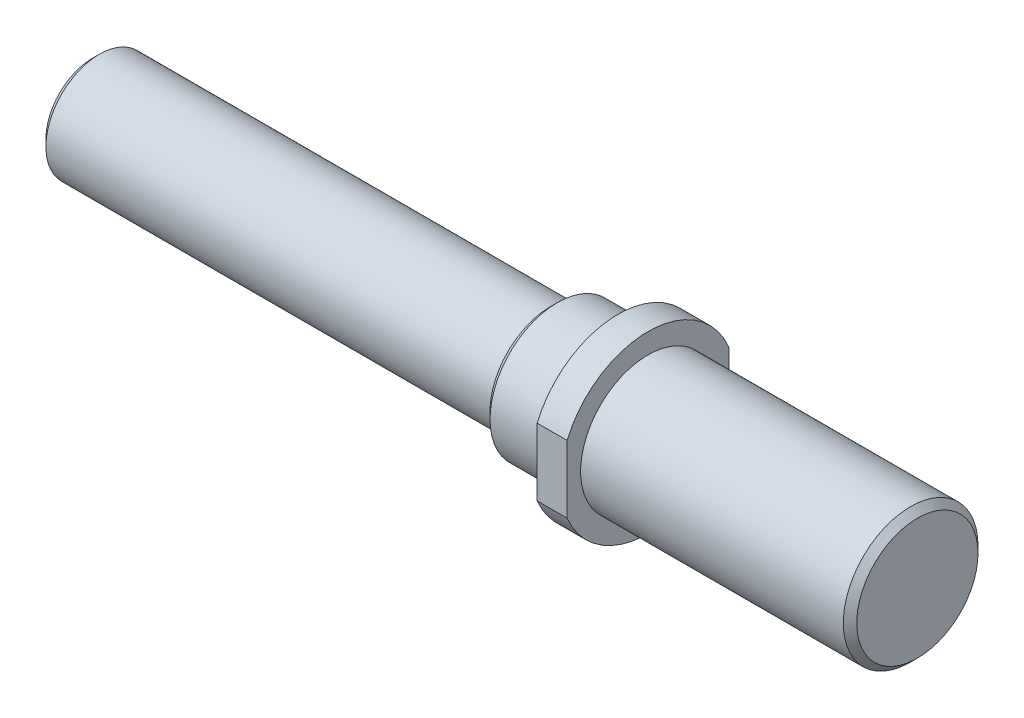
ISO-10303-21;
HEADER;
FILE_DESCRIPTION(('STEP AP214'),'2;1');
FILE_NAME('part.step','',(''),(''),'','','');
FILE_SCHEMA(('AUTOMOTIVE_DESIGN { 1 0 10303 214 1 1 1 1 }'));
ENDSEC;
DATA;
#1=APPLICATION_CONTEXT('core data for automotive mechanical design processes');
#2=APPLICATION_PROTOCOL_DEFINITION('international standard','automotive_design',2000,#1);
#3=PRODUCT_CONTEXT('',#1,'mechanical');
#4=PRODUCT('Part','Part','',(#3));
#5=PRODUCT_RELATED_PRODUCT_CATEGORY('part','',(#4));
#6=PRODUCT_DEFINITION_FORMATION('','',#4);
#7=PRODUCT_DEFINITION_CONTEXT('part definition',#1,'design');
#8=PRODUCT_DEFINITION('design','',#6,#7);
#9=PRODUCT_DEFINITION_SHAPE('','',#8);
#10=(LENGTH_UNIT() NAMED_UNIT(*) SI_UNIT(.MILLI.,.METRE.));
#11=(NAMED_UNIT(*) PLANE_ANGLE_UNIT() SI_UNIT($,.RADIAN.));
#12=(NAMED_UNIT(*) SI_UNIT($,.STERADIAN.) SOLID_ANGLE_UNIT());
#13=UNCERTAINTY_MEASURE_WITH_UNIT(LENGTH_MEASURE(1.E-05),#10,'distance_accuracy_value','');
#14=(GEOMETRIC_REPRESENTATION_CONTEXT(3) GLOBAL_UNCERTAINTY_ASSIGNED_CONTEXT((#13)) GLOBAL_UNIT_ASSIGNED_CONTEXT((#10,
#11,#12)) REPRESENTATION_CONTEXT('',''));
#15=CARTESIAN_POINT('',(0.,0.,0.));
#16=DIRECTION('',(0.,0.,1.));
#17=DIRECTION('',(1.,0.,0.));
#18=AXIS2_PLACEMENT_3D('',#15,#16,#17);
#19=CARTESIAN_POINT('',(20.,0.,0.));
#20=DIRECTION('',(-1.,0.,0.));
#21=DIRECTION('',(0.,0.,1.));
#22=AXIS2_PLACEMENT_3D('',#19,#20,#21);
#23=CYLINDRICAL_SURFACE('',#22,6.5);
#24=DIRECTION('',(1.,0.,0.));
#25=VECTOR('',#24,1.);
#26=CARTESIAN_POINT('',(-41.225,2.50000000000001,-6.));
#27=LINE('',#26,#25);
#28=CARTESIAN_POINT('',(-2.22500000000001,2.50000000000001,-6.));
#29=VERTEX_POINT('',#28);
#30=CARTESIAN_POINT('',(0.,2.50000000000001,-6.));
#31=VERTEX_POINT('',#30);
#32=EDGE_CURVE('E49',#29,#31,#27,.T.);
#33=ORIENTED_EDGE('',*,*,#32,.F.);
#34=CARTESIAN_POINT('',(-2.225,0.,0.));
#35=DIRECTION('',(-1.,0.,0.));
#36=DIRECTION('',(0.,0.,1.));
#37=AXIS2_PLACEMENT_3D('',#34,#35,#36);
#38=CIRCLE('',#37,6.5);
#39=CARTESIAN_POINT('',(-2.22500000000001,2.5,6.));
#40=VERTEX_POINT('',#39);
#41=EDGE_CURVE('E96',#40,#29,#38,.T.);
#42=ORIENTED_EDGE('',*,*,#41,.F.);
#43=DIRECTION('',(1.,0.,0.));
#44=VECTOR('',#43,1.);
#45=CARTESIAN_POINT('',(-41.225,2.5,6.));
#46=LINE('',#45,#44);
#47=CARTESIAN_POINT('',(0.,2.5,6.));
#48=VERTEX_POINT('',#47);
#49=EDGE_CURVE('E183',#40,#48,#46,.T.);
#50=ORIENTED_EDGE('',*,*,#49,.T.);
#51=CARTESIAN_POINT('',(0.,0.,0.));
#52=DIRECTION('',(1.,0.,0.));
#53=DIRECTION('',(0.,0.,-1.));
#54=AXIS2_PLACEMENT_3D('',#51,#52,#53);
#55=CIRCLE('',#54,6.5);
#56=EDGE_CURVE('E94',#31,#48,#55,.T.);
#57=ORIENTED_EDGE('',*,*,#56,.F.);
#58=EDGE_LOOP('',(#33,#42,#50,#57));
#59=FACE_BOUND('',#58,.T.);
#60=ADVANCED_FACE('F34',(#59),#23,.T.);
#61=DIRECTION('',(1.,0.,0.));
#62=VECTOR('',#61,1.);
#63=CARTESIAN_POINT('',(-41.225,-2.50000000000001,-6.));
#64=LINE('',#63,#62);
#65=CARTESIAN_POINT('',(-2.22500000000001,-2.50000000000001,-6.));
#66=VERTEX_POINT('',#65);
#67=CARTESIAN_POINT('',(0.,-2.50000000000001,-6.));
#68=VERTEX_POINT('',#67);
#69=EDGE_CURVE('E77',#66,#68,#64,.T.);
#70=ORIENTED_EDGE('',*,*,#69,.T.);
#71=CARTESIAN_POINT('',(0.,-2.5,6.));
#72=VERTEX_POINT('',#71);
#73=EDGE_CURVE('E87',#72,#68,#55,.T.);
#74=ORIENTED_EDGE('',*,*,#73,.F.);
#75=DIRECTION('',(1.,0.,0.));
#76=VECTOR('',#75,1.);
#77=CARTESIAN_POINT('',(-41.225,-2.5,6.));
#78=LINE('',#77,#76);
#79=CARTESIAN_POINT('',(-2.22500000000001,-2.5,6.));
#80=VERTEX_POINT('',#79);
#81=EDGE_CURVE('E57',#80,#72,#78,.T.);
#82=ORIENTED_EDGE('',*,*,#81,.F.);
#83=EDGE_CURVE('E88',#66,#80,#38,.T.);
#84=ORIENTED_EDGE('',*,*,#83,.F.);
#85=EDGE_LOOP('',(#70,#74,#82,#84));
#86=FACE_BOUND('',#85,.T.);
#87=ADVANCED_FACE('F86',(#86),#23,.T.);
#88=CARTESIAN_POINT('',(-2.225,0.,0.));
#89=DIRECTION('',(-1.,0.,0.));
#90=DIRECTION('',(0.,0.,1.));
#91=AXIS2_PLACEMENT_3D('',#88,#89,#90);
#92=PLANE('',#91);
#93=DIRECTION('',(0.,1.,0.));
#94=VECTOR('',#93,1.);
#95=CARTESIAN_POINT('',(-2.225,0.,-6.));
#96=LINE('',#95,#94);
#97=EDGE_CURVE('E89',#66,#29,#96,.T.);
#98=ORIENTED_EDGE('',*,*,#97,.F.);
#99=ORIENTED_EDGE('',*,*,#83,.T.);
#100=DIRECTION('',(0.,-1.,0.));
#101=VECTOR('',#100,1.);
#102=CARTESIAN_POINT('',(-2.225,0.,6.));
#103=LINE('',#102,#101);
#104=EDGE_CURVE('E182',#40,#80,#103,.T.);
#105=ORIENTED_EDGE('',*,*,#104,.F.);
#106=ORIENTED_EDGE('',*,*,#41,.T.);
#107=EDGE_LOOP('',(#98,#99,#105,#106));
#108=FACE_BOUND('',#107,.T.);
#109=CARTESIAN_POINT('',(-2.225,0.,0.));
#110=DIRECTION('',(-1.,0.,0.));
#111=DIRECTION('',(0.,0.,1.));
#112=AXIS2_PLACEMENT_3D('',#109,#110,#111);
#113=CIRCLE('',#112,5.);
#114=CARTESIAN_POINT('',(-2.225,0.,5.));
#115=VERTEX_POINT('',#114);
#116=EDGE_CURVE('E103',#115,#115,#113,.T.);
#117=ORIENTED_EDGE('',*,*,#116,.F.);
#118=EDGE_LOOP('',(#117));
#119=FACE_BOUND('',#118,.T.);
#120=ADVANCED_FACE('F144',(#108,#119),#92,.T.);
#121=CARTESIAN_POINT('',(-7.225,0.,0.));
#122=DIRECTION('',(1.,0.,0.));
#123=DIRECTION('',(0.,0.,-1.));
#124=AXIS2_PLACEMENT_3D('',#121,#122,#123);
#125=PLANE('',#124);
#126=CARTESIAN_POINT('',(-7.225,0.,0.));
#127=DIRECTION('',(1.,0.,0.));
#128=DIRECTION('',(0.,0.,-1.));
#129=AXIS2_PLACEMENT_3D('',#126,#127,#128);
#130=CIRCLE('',#129,4.49999999999998);
#131=CARTESIAN_POINT('',(-7.225,0.,-4.49999999999998));
#132=VERTEX_POINT('',#131);
#133=EDGE_CURVE('E42',#132,#132,#130,.F.);
#134=ORIENTED_EDGE('',*,*,#133,.T.);
#135=EDGE_LOOP('',(#134));
#136=FACE_BOUND('',#135,.T.);
#137=CARTESIAN_POINT('',(-7.225,0.,0.));
#138=DIRECTION('',(1.,0.,0.));
#139=DIRECTION('',(0.,0.,-1.));
#140=AXIS2_PLACEMENT_3D('',#137,#138,#139);
#141=CIRCLE('',#140,3.96875);
#142=CARTESIAN_POINT('',(-7.225,0.,-3.96875));
#143=VERTEX_POINT('',#142);
#144=EDGE_CURVE('E106',#143,#143,#141,.T.);
#145=ORIENTED_EDGE('',*,*,#144,.T.);
#146=EDGE_LOOP('',(#145));
#147=FACE_BOUND('',#146,.T.);
#148=ADVANCED_FACE('F123',(#136,#147),#125,.F.);
#149=CARTESIAN_POINT('',(-41.225,0.,0.));
#150=DIRECTION('',(1.,0.,0.));
#151=DIRECTION('',(0.,0.,-1.));
#152=AXIS2_PLACEMENT_3D('',#149,#150,#151);
#153=CYLINDRICAL_SURFACE('',#152,3.96875);
#154=CARTESIAN_POINT('',(-40.725,0.,0.));
#155=DIRECTION('',(1.,0.,0.));
#156=DIRECTION('',(0.,0.,-1.));
#157=AXIS2_PLACEMENT_3D('',#154,#155,#156);
#158=CIRCLE('',#157,3.96875);
#159=CARTESIAN_POINT('',(-40.725,0.,-3.96875));
#160=VERTEX_POINT('',#159);
#161=EDGE_CURVE('E115',#160,#160,#158,.T.);
#162=ORIENTED_EDGE('',*,*,#161,.T.);
#163=EDGE_LOOP('',(#162));
#164=FACE_BOUND('',#163,.T.);
#165=ORIENTED_EDGE('',*,*,#144,.F.);
#166=EDGE_LOOP('',(#165));
#167=FACE_BOUND('',#166,.T.);
#168=ADVANCED_FACE('F156',(#164,#167),#153,.T.);
#169=CARTESIAN_POINT('',(-41.225,0.,0.));
#170=DIRECTION('',(1.,0.,0.));
#171=DIRECTION('',(0.,0.,-1.));
#172=AXIS2_PLACEMENT_3D('',#169,#170,#171);
#173=PLANE('',#172);
#174=CARTESIAN_POINT('',(-41.225,0.,0.));
#175=DIRECTION('',(1.,0.,0.));
#176=DIRECTION('',(0.,0.,-1.));
#177=AXIS2_PLACEMENT_3D('',#174,#175,#176);
#178=CIRCLE('',#177,3.46875);
#179=CARTESIAN_POINT('',(-41.225,0.,-3.46875));
#180=VERTEX_POINT('',#179);
#181=EDGE_CURVE('E118',#180,#180,#178,.F.);
#182=ORIENTED_EDGE('',*,*,#181,.T.);
#183=EDGE_LOOP('',(#182));
#184=FACE_BOUND('',#183,.T.);
#185=ADVANCED_FACE('F151',(#184),#173,.F.);
#186=CARTESIAN_POINT('',(-2.225,0.,0.));
#187=DIRECTION('',(-1.,0.,0.));
#188=DIRECTION('',(0.,0.,1.));
#189=AXIS2_PLACEMENT_3D('',#186,#187,#188);
#190=CYLINDRICAL_SURFACE('',#189,5.);
#191=CARTESIAN_POINT('',(-6.72499999999999,0.,0.));
#192=DIRECTION('',(1.,0.,0.));
#193=DIRECTION('',(0.,0.,-1.));
#194=AXIS2_PLACEMENT_3D('',#191,#192,#193);
#195=CIRCLE('',#194,5.);
#196=CARTESIAN_POINT('',(-6.72499999999999,0.,-5.));
#197=VERTEX_POINT('',#196);
#198=EDGE_CURVE('E11',#197,#197,#195,.T.);
#199=ORIENTED_EDGE('',*,*,#198,.T.);
#200=EDGE_LOOP('',(#199));
#201=FACE_BOUND('',#200,.T.);
#202=ORIENTED_EDGE('',*,*,#116,.T.);
#203=EDGE_LOOP('',(#202));
#204=FACE_BOUND('',#203,.T.);
#205=ADVANCED_FACE('F148',(#201,#204),#190,.T.);
#206=CARTESIAN_POINT('',(0.,0.,0.));
#207=DIRECTION('',(1.,0.,0.));
#208=DIRECTION('',(0.,0.,-1.));
#209=AXIS2_PLACEMENT_3D('',#206,#207,#208);
#210=PLANE('',#209);
#211=DIRECTION('',(0.,-1.,0.));
#212=VECTOR('',#211,1.);
#213=CARTESIAN_POINT('',(0.,2.50000000000001,-6.));
#214=LINE('',#213,#212);
#215=EDGE_CURVE('E74',#31,#68,#214,.T.);
#216=ORIENTED_EDGE('',*,*,#215,.F.);
#217=ORIENTED_EDGE('',*,*,#56,.T.);
#218=DIRECTION('',(0.,1.,0.));
#219=VECTOR('',#218,1.);
#220=CARTESIAN_POINT('',(0.,-2.5,6.));
#221=LINE('',#220,#219);
#222=EDGE_CURVE('E93',#72,#48,#221,.T.);
#223=ORIENTED_EDGE('',*,*,#222,.F.);
#224=ORIENTED_EDGE('',*,*,#73,.T.);
#225=EDGE_LOOP('',(#216,#217,#223,#224));
#226=FACE_BOUND('',#225,.T.);
#227=CARTESIAN_POINT('',(0.,0.,0.));
#228=DIRECTION('',(1.,0.,0.));
#229=DIRECTION('',(0.,0.,-1.));
#230=AXIS2_PLACEMENT_3D('',#227,#228,#229);
#231=CIRCLE('',#230,5.);
#232=CARTESIAN_POINT('',(0.,0.,-5.));
#233=VERTEX_POINT('',#232);
#234=EDGE_CURVE('E98',#233,#233,#231,.T.);
#235=ORIENTED_EDGE('',*,*,#234,.F.);
#236=EDGE_LOOP('',(#235));
#237=FACE_BOUND('',#236,.T.);
#238=ADVANCED_FACE('F91',(#226,#237),#210,.T.);
#239=CARTESIAN_POINT('',(0.,0.,0.));
#240=DIRECTION('',(1.,0.,0.));
#241=DIRECTION('',(0.,0.,-1.));
#242=AXIS2_PLACEMENT_3D('',#239,#240,#241);
#243=CYLINDRICAL_SURFACE('',#242,5.);
#244=CARTESIAN_POINT('',(19.5,0.,0.));
#245=DIRECTION('',(1.,0.,0.));
#246=DIRECTION('',(0.,0.,-1.));
#247=AXIS2_PLACEMENT_3D('',#244,#245,#246);
#248=CIRCLE('',#247,5.);
#249=CARTESIAN_POINT('',(19.5,0.,-5.));
#250=VERTEX_POINT('',#249);
#251=EDGE_CURVE('E112',#250,#250,#248,.F.);
#252=ORIENTED_EDGE('',*,*,#251,.T.);
#253=EDGE_LOOP('',(#252));
#254=FACE_BOUND('',#253,.T.);
#255=ORIENTED_EDGE('',*,*,#234,.T.);
#256=EDGE_LOOP('',(#255));
#257=FACE_BOUND('',#256,.T.);
#258=ADVANCED_FACE('F168',(#254,#257),#243,.T.);
#259=CARTESIAN_POINT('',(20.,0.,0.));
#260=DIRECTION('',(1.,0.,0.));
#261=DIRECTION('',(0.,0.,-1.));
#262=AXIS2_PLACEMENT_3D('',#259,#260,#261);
#263=PLANE('',#262);
#264=CARTESIAN_POINT('',(20.,0.,0.));
#265=DIRECTION('',(1.,0.,0.));
#266=DIRECTION('',(0.,0.,-1.));
#267=AXIS2_PLACEMENT_3D('',#264,#265,#266);
#268=CIRCLE('',#267,4.5);
#269=CARTESIAN_POINT('',(20.,0.,-4.5));
#270=VERTEX_POINT('',#269);
#271=EDGE_CURVE('E109',#270,#270,#268,.T.);
#272=ORIENTED_EDGE('',*,*,#271,.T.);
#273=EDGE_LOOP('',(#272));
#274=FACE_BOUND('',#273,.T.);
#275=ADVANCED_FACE('F165',(#274),#263,.T.);
#276=CARTESIAN_POINT('',(20.,0.,0.));
#277=DIRECTION('',(-1.,0.,0.));
#278=DIRECTION('',(0.,0.,1.));
#279=AXIS2_PLACEMENT_3D('',#276,#277,#278);
#280=CONICAL_SURFACE('',#279,4.5,0.785398163397451);
#281=ORIENTED_EDGE('',*,*,#251,.F.);
#282=EDGE_LOOP('',(#281));
#283=FACE_BOUND('',#282,.T.);
#284=ORIENTED_EDGE('',*,*,#271,.F.);
#285=EDGE_LOOP('',(#284));
#286=FACE_BOUND('',#285,.T.);
#287=ADVANCED_FACE('F135',(#283,#286),#280,.T.);
#288=CARTESIAN_POINT('',(-40.725,0.,0.));
#289=DIRECTION('',(1.,0.,0.));
#290=DIRECTION('',(0.,0.,-1.));
#291=AXIS2_PLACEMENT_3D('',#288,#289,#290);
#292=CONICAL_SURFACE('',#291,3.96875,0.785398163397448);
#293=ORIENTED_EDGE('',*,*,#181,.F.);
#294=EDGE_LOOP('',(#293));
#295=FACE_BOUND('',#294,.T.);
#296=ORIENTED_EDGE('',*,*,#161,.F.);
#297=EDGE_LOOP('',(#296));
#298=FACE_BOUND('',#297,.T.);
#299=ADVANCED_FACE('F128',(#295,#298),#292,.T.);
#300=CARTESIAN_POINT('',(-7.225,0.,0.));
#301=DIRECTION('',(1.,0.,0.));
#302=DIRECTION('',(0.,0.,-1.));
#303=AXIS2_PLACEMENT_3D('',#300,#301,#302);
#304=CONICAL_SURFACE('',#303,4.49999999999998,0.785398163397452);
#305=ORIENTED_EDGE('',*,*,#198,.F.);
#306=EDGE_LOOP('',(#305));
#307=FACE_BOUND('',#306,.T.);
#308=ORIENTED_EDGE('',*,*,#133,.F.);
#309=EDGE_LOOP('',(#308));
#310=FACE_BOUND('',#309,.T.);
#311=ADVANCED_FACE('F36',(#307,#310),#304,.T.);
#312=CARTESIAN_POINT('',(-41.225,-2.5,6.));
#313=DIRECTION('',(0.,0.,-1.));
#314=DIRECTION('',(-1.,0.,0.));
#315=AXIS2_PLACEMENT_3D('',#312,#313,#314);
#316=PLANE('',#315);
#317=ORIENTED_EDGE('',*,*,#104,.T.);
#318=ORIENTED_EDGE('',*,*,#81,.T.);
#319=ORIENTED_EDGE('',*,*,#222,.T.);
#320=ORIENTED_EDGE('',*,*,#49,.F.);
#321=EDGE_LOOP('',(#317,#318,#319,#320));
#322=FACE_BOUND('',#321,.T.);
#323=ADVANCED_FACE('F127',(#322),#316,.F.);
#324=CARTESIAN_POINT('',(-41.225,2.50000000000001,-6.));
#325=DIRECTION('',(0.,0.,1.));
#326=DIRECTION('',(1.,0.,0.));
#327=AXIS2_PLACEMENT_3D('',#324,#325,#326);
#328=PLANE('',#327);
#329=ORIENTED_EDGE('',*,*,#97,.T.);
#330=ORIENTED_EDGE('',*,*,#32,.T.);
#331=ORIENTED_EDGE('',*,*,#215,.T.);
#332=ORIENTED_EDGE('',*,*,#69,.F.);
#333=EDGE_LOOP('',(#329,#330,#331,#332));
#334=FACE_BOUND('',#333,.T.);
#335=ADVANCED_FACE('F76',(#334),#328,.F.);
#336=CLOSED_SHELL('',(#60,#87,#120,#148,#168,#185,#205,#238,#258,#275,#287,#299,#311,#323,#335));
#337=MANIFOLD_SOLID_BREP('B2',#336);
#338=ADVANCED_BREP_SHAPE_REPRESENTATION('',(#18,#337),#14);
#339=SHAPE_DEFINITION_REPRESENTATION(#9,#338);
ENDSEC;
END-ISO-10303-21;
